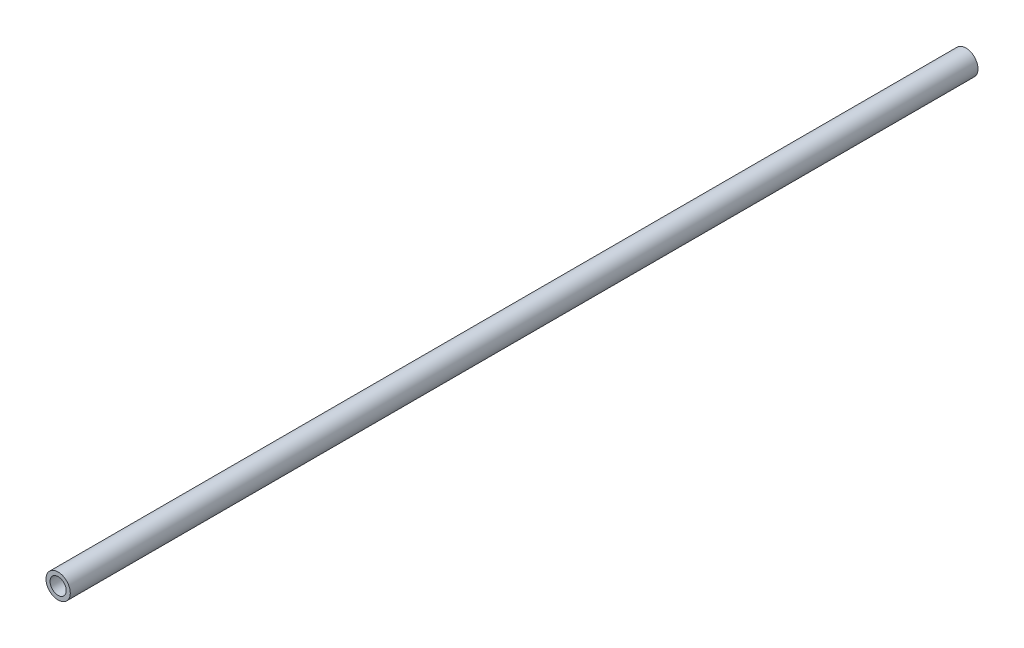
ISO-10303-21;
HEADER;
FILE_DESCRIPTION(('STEP AP214'),'2;1');
FILE_NAME('part.step','',(''),(''),'','','');
FILE_SCHEMA(('AUTOMOTIVE_DESIGN { 1 0 10303 214 1 1 1 1 }'));
ENDSEC;
DATA;
#1=APPLICATION_CONTEXT('core data for automotive mechanical design processes');
#2=APPLICATION_PROTOCOL_DEFINITION('international standard','automotive_design',2000,#1);
#3=PRODUCT_CONTEXT('',#1,'mechanical');
#4=PRODUCT('Part','Part','',(#3));
#5=PRODUCT_RELATED_PRODUCT_CATEGORY('part','',(#4));
#6=PRODUCT_DEFINITION_FORMATION('','',#4);
#7=PRODUCT_DEFINITION_CONTEXT('part definition',#1,'design');
#8=PRODUCT_DEFINITION('design','',#6,#7);
#9=PRODUCT_DEFINITION_SHAPE('','',#8);
#10=(LENGTH_UNIT() NAMED_UNIT(*) SI_UNIT(.MILLI.,.METRE.));
#11=(NAMED_UNIT(*) PLANE_ANGLE_UNIT() SI_UNIT($,.RADIAN.));
#12=(NAMED_UNIT(*) SI_UNIT($,.STERADIAN.) SOLID_ANGLE_UNIT());
#13=UNCERTAINTY_MEASURE_WITH_UNIT(LENGTH_MEASURE(1.E-05),#10,'distance_accuracy_value','');
#14=(GEOMETRIC_REPRESENTATION_CONTEXT(3) GLOBAL_UNCERTAINTY_ASSIGNED_CONTEXT((#13)) GLOBAL_UNIT_ASSIGNED_CONTEXT((#10,
#11,#12)) REPRESENTATION_CONTEXT('',''));
#15=CARTESIAN_POINT('',(0.,0.,0.));
#16=DIRECTION('',(0.,0.,1.));
#17=DIRECTION('',(1.,0.,0.));
#18=AXIS2_PLACEMENT_3D('',#15,#16,#17);
#19=CARTESIAN_POINT('',(0.,0.,560.));
#20=DIRECTION('',(0.,0.,1.));
#21=DIRECTION('',(1.,0.,0.));
#22=AXIS2_PLACEMENT_3D('',#19,#20,#21);
#23=PLANE('',#22);
#24=CARTESIAN_POINT('',(0.,0.,560.));
#25=DIRECTION('',(0.,0.,1.));
#26=DIRECTION('',(1.,0.,0.));
#27=AXIS2_PLACEMENT_3D('',#24,#25,#26);
#28=CIRCLE('',#27,7.5);
#29=CARTESIAN_POINT('',(7.5,0.,560.));
#30=VERTEX_POINT('',#29);
#31=EDGE_CURVE('E10',#30,#30,#28,.T.);
#32=ORIENTED_EDGE('',*,*,#31,.T.);
#33=EDGE_LOOP('',(#32));
#34=FACE_BOUND('',#33,.T.);
#35=CARTESIAN_POINT('',(0.,0.,560.));
#36=DIRECTION('',(0.,0.,1.));
#37=DIRECTION('',(1.,0.,0.));
#38=AXIS2_PLACEMENT_3D('',#35,#36,#37);
#39=CIRCLE('',#38,5.);
#40=CARTESIAN_POINT('',(5.,0.,560.));
#41=VERTEX_POINT('',#40);
#42=EDGE_CURVE('E56',#41,#41,#39,.T.);
#43=ORIENTED_EDGE('',*,*,#42,.F.);
#44=EDGE_LOOP('',(#43));
#45=FACE_BOUND('',#44,.T.);
#46=ADVANCED_FACE('F43',(#34,#45),#23,.T.);
#47=CARTESIAN_POINT('',(0.,0.,0.));
#48=DIRECTION('',(0.,0.,1.));
#49=DIRECTION('',(1.,0.,0.));
#50=AXIS2_PLACEMENT_3D('',#47,#48,#49);
#51=PLANE('',#50);
#52=CARTESIAN_POINT('',(0.,0.,0.));
#53=DIRECTION('',(0.,0.,1.));
#54=DIRECTION('',(1.,0.,0.));
#55=AXIS2_PLACEMENT_3D('',#52,#53,#54);
#56=CIRCLE('',#55,7.5);
#57=CARTESIAN_POINT('',(7.5,0.,0.));
#58=VERTEX_POINT('',#57);
#59=EDGE_CURVE('E47',#58,#58,#56,.T.);
#60=ORIENTED_EDGE('',*,*,#59,.F.);
#61=EDGE_LOOP('',(#60));
#62=FACE_BOUND('',#61,.T.);
#63=CARTESIAN_POINT('',(0.,0.,0.));
#64=DIRECTION('',(0.,0.,1.));
#65=DIRECTION('',(1.,0.,0.));
#66=AXIS2_PLACEMENT_3D('',#63,#64,#65);
#67=CIRCLE('',#66,5.);
#68=CARTESIAN_POINT('',(5.,0.,0.));
#69=VERTEX_POINT('',#68);
#70=EDGE_CURVE('E58',#69,#69,#67,.T.);
#71=ORIENTED_EDGE('',*,*,#70,.T.);
#72=EDGE_LOOP('',(#71));
#73=FACE_BOUND('',#72,.T.);
#74=ADVANCED_FACE('F70',(#62,#73),#51,.F.);
#75=CARTESIAN_POINT('',(0.,0.,560.));
#76=DIRECTION('',(0.,0.,-1.));
#77=DIRECTION('',(-1.,0.,0.));
#78=AXIS2_PLACEMENT_3D('',#75,#76,#77);
#79=CYLINDRICAL_SURFACE('',#78,7.5);
#80=ORIENTED_EDGE('',*,*,#31,.F.);
#81=EDGE_LOOP('',(#80));
#82=FACE_BOUND('',#81,.T.);
#83=ORIENTED_EDGE('',*,*,#59,.T.);
#84=EDGE_LOOP('',(#83));
#85=FACE_BOUND('',#84,.T.);
#86=ADVANCED_FACE('F45',(#82,#85),#79,.T.);
#87=CARTESIAN_POINT('',(0.,0.,560.));
#88=DIRECTION('',(0.,0.,-1.));
#89=DIRECTION('',(-1.,0.,0.));
#90=AXIS2_PLACEMENT_3D('',#87,#88,#89);
#91=CYLINDRICAL_SURFACE('',#90,5.);
#92=ORIENTED_EDGE('',*,*,#42,.T.);
#93=EDGE_LOOP('',(#92));
#94=FACE_BOUND('',#93,.T.);
#95=ORIENTED_EDGE('',*,*,#70,.F.);
#96=EDGE_LOOP('',(#95));
#97=FACE_BOUND('',#96,.T.);
#98=ADVANCED_FACE('F66',(#94,#97),#91,.F.);
#99=CLOSED_SHELL('',(#46,#74,#86,#98));
#100=MANIFOLD_SOLID_BREP('B2',#99);
#101=ADVANCED_BREP_SHAPE_REPRESENTATION('',(#18,#100),#14);
#102=SHAPE_DEFINITION_REPRESENTATION(#9,#101);
ENDSEC;
END-ISO-10303-21;
